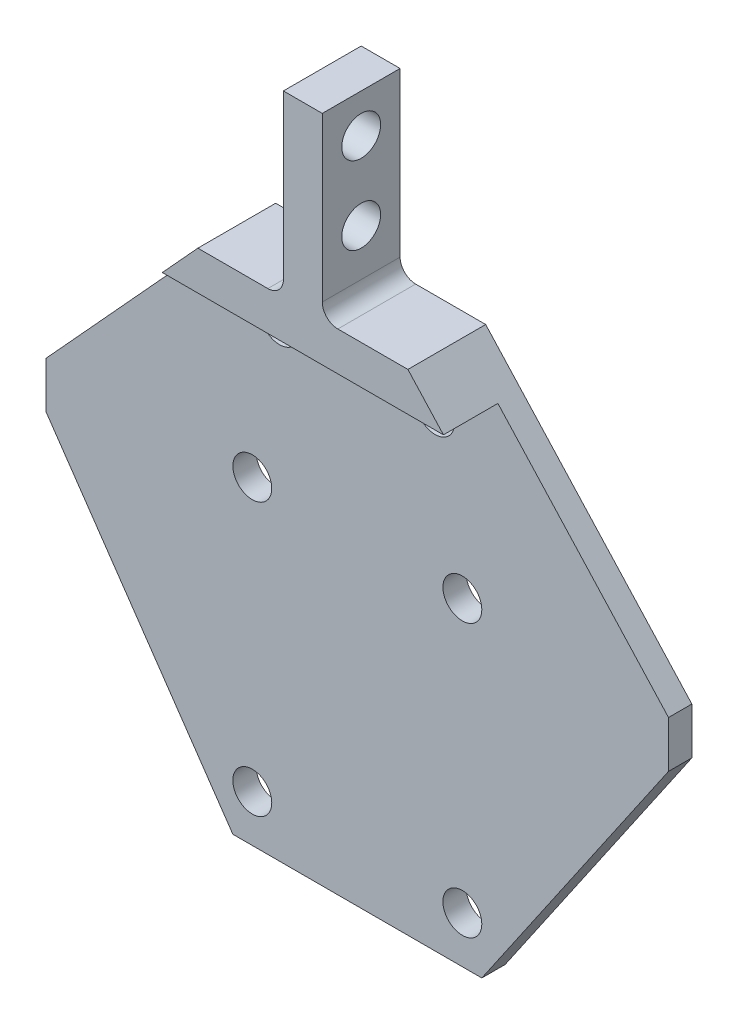
ISO-10303-21;
HEADER;
FILE_DESCRIPTION(('STEP AP214'),'2;1');
FILE_NAME('part.step','',(''),(''),'','','');
FILE_SCHEMA(('AUTOMOTIVE_DESIGN { 1 0 10303 214 1 1 1 1 }'));
ENDSEC;
DATA;
#1=APPLICATION_CONTEXT('core data for automotive mechanical design processes');
#2=APPLICATION_PROTOCOL_DEFINITION('international standard','automotive_design',2000,#1);
#3=PRODUCT_CONTEXT('',#1,'mechanical');
#4=PRODUCT('Part','Part','',(#3));
#5=PRODUCT_RELATED_PRODUCT_CATEGORY('part','',(#4));
#6=PRODUCT_DEFINITION_FORMATION('','',#4);
#7=PRODUCT_DEFINITION_CONTEXT('part definition',#1,'design');
#8=PRODUCT_DEFINITION('design','',#6,#7);
#9=PRODUCT_DEFINITION_SHAPE('','',#8);
#10=(LENGTH_UNIT() NAMED_UNIT(*) SI_UNIT(.MILLI.,.METRE.));
#11=(NAMED_UNIT(*) PLANE_ANGLE_UNIT() SI_UNIT($,.RADIAN.));
#12=(NAMED_UNIT(*) SI_UNIT($,.STERADIAN.) SOLID_ANGLE_UNIT());
#13=UNCERTAINTY_MEASURE_WITH_UNIT(LENGTH_MEASURE(1.E-05),#10,'distance_accuracy_value','');
#14=(GEOMETRIC_REPRESENTATION_CONTEXT(3) GLOBAL_UNCERTAINTY_ASSIGNED_CONTEXT((#13)) GLOBAL_UNIT_ASSIGNED_CONTEXT((#10,
#11,#12)) REPRESENTATION_CONTEXT('',''));
#15=CARTESIAN_POINT('',(0.,0.,0.));
#16=DIRECTION('',(0.,0.,1.));
#17=DIRECTION('',(1.,0.,0.));
#18=AXIS2_PLACEMENT_3D('',#15,#16,#17);
#19=CARTESIAN_POINT('',(0.,29.,3.));
#20=DIRECTION('',(0.,1.,0.));
#21=DIRECTION('',(0.,0.,1.));
#22=AXIS2_PLACEMENT_3D('',#19,#20,#21);
#23=PLANE('',#22);
#24=DIRECTION('',(-1.,0.,0.));
#25=VECTOR('',#24,1.);
#26=CARTESIAN_POINT('',(13.5,29.,10.));
#27=LINE('',#26,#25);
#28=CARTESIAN_POINT('',(-4.50437935032591,29.,10.));
#29=VERTEX_POINT('',#28);
#30=CARTESIAN_POINT('',(-13.5,29.,10.));
#31=VERTEX_POINT('',#30);
#32=EDGE_CURVE('E200',#29,#31,#27,.T.);
#33=ORIENTED_EDGE('',*,*,#32,.F.);
#34=DIRECTION('',(0.,0.,-1.));
#35=VECTOR('',#34,1.);
#36=CARTESIAN_POINT('',(-4.50437935032591,29.,3.));
#37=LINE('',#36,#35);
#38=CARTESIAN_POINT('',(-4.50437935032591,29.,0.));
#39=VERTEX_POINT('',#38);
#40=EDGE_CURVE('E313',#29,#39,#37,.T.);
#41=ORIENTED_EDGE('',*,*,#40,.T.);
#42=DIRECTION('',(1.,0.,0.));
#43=VECTOR('',#42,1.);
#44=CARTESIAN_POINT('',(0.,29.,0.));
#45=LINE('',#44,#43);
#46=CARTESIAN_POINT('',(-13.5,29.,0.));
#47=VERTEX_POINT('',#46);
#48=EDGE_CURVE('E261',#47,#39,#45,.T.);
#49=ORIENTED_EDGE('',*,*,#48,.F.);
#50=DIRECTION('',(0.,0.,-1.));
#51=VECTOR('',#50,1.);
#52=CARTESIAN_POINT('',(-13.5,29.,3.));
#53=LINE('',#52,#51);
#54=EDGE_CURVE('E297',#31,#47,#53,.T.);
#55=ORIENTED_EDGE('',*,*,#54,.F.);
#56=EDGE_LOOP('',(#33,#41,#49,#55));
#57=FACE_BOUND('',#56,.T.);
#58=ADVANCED_FACE('F41',(#57),#23,.T.);
#59=CARTESIAN_POINT('',(21.7981532480156,19.9190021059452,3.));
#60=DIRECTION('',(0.738209882892656,0.674571099884668,0.));
#61=DIRECTION('',(-0.674571099884668,0.738209882892656,0.));
#62=AXIS2_PLACEMENT_3D('',#59,#60,#61);
#63=PLANE('',#62);
#64=DIRECTION('',(0.674571099884668,-0.738209882892656,0.));
#65=VECTOR('',#64,1.);
#66=CARTESIAN_POINT('',(21.7981532480156,19.9190021059452,0.));
#67=LINE('',#66,#65);
#68=CARTESIAN_POINT('',(13.5,29.,0.));
#69=VERTEX_POINT('',#68);
#70=CARTESIAN_POINT('',(40.,0.,0.));
#71=VERTEX_POINT('',#70);
#72=EDGE_CURVE('E258',#69,#71,#67,.T.);
#73=ORIENTED_EDGE('',*,*,#72,.F.);
#74=DIRECTION('',(0.,0.,-1.));
#75=VECTOR('',#74,1.);
#76=CARTESIAN_POINT('',(13.5,29.,3.));
#77=LINE('',#76,#75);
#78=CARTESIAN_POINT('',(13.5,29.,10.));
#79=VERTEX_POINT('',#78);
#80=EDGE_CURVE('E299',#79,#69,#77,.T.);
#81=ORIENTED_EDGE('',*,*,#80,.F.);
#82=DIRECTION('',(-0.674571099884668,0.738209882892656,0.));
#83=VECTOR('',#82,1.);
#84=CARTESIAN_POINT('',(18.0689655172414,24.,10.));
#85=LINE('',#84,#83);
#86=CARTESIAN_POINT('',(18.0689655172414,24.,10.));
#87=VERTEX_POINT('',#86);
#88=EDGE_CURVE('E204',#87,#79,#85,.T.);
#89=ORIENTED_EDGE('',*,*,#88,.F.);
#90=DIRECTION('',(0.,0.,-1.));
#91=VECTOR('',#90,1.);
#92=CARTESIAN_POINT('',(18.0689655172414,24.,10.));
#93=LINE('',#92,#91);
#94=CARTESIAN_POINT('',(18.0689655172414,24.,3.));
#95=VERTEX_POINT('',#94);
#96=EDGE_CURVE('E207',#87,#95,#93,.T.);
#97=ORIENTED_EDGE('',*,*,#96,.T.);
#98=DIRECTION('',(0.674571099884668,-0.738209882892656,0.));
#99=VECTOR('',#98,1.);
#100=CARTESIAN_POINT('',(21.7981532480156,19.9190021059452,3.));
#101=LINE('',#100,#99);
#102=CARTESIAN_POINT('',(40.,0.,3.));
#103=VERTEX_POINT('',#102);
#104=EDGE_CURVE('E226',#95,#103,#101,.T.);
#105=ORIENTED_EDGE('',*,*,#104,.T.);
#106=DIRECTION('',(0.,0.,-1.));
#107=VECTOR('',#106,1.);
#108=CARTESIAN_POINT('',(40.,0.,3.));
#109=LINE('',#108,#107);
#110=EDGE_CURVE('E249',#103,#71,#109,.T.);
#111=ORIENTED_EDGE('',*,*,#110,.T.);
#112=EDGE_LOOP('',(#73,#81,#89,#97,#105,#111));
#113=FACE_BOUND('',#112,.T.);
#114=ADVANCED_FACE('F333',(#113),#63,.T.);
#115=CARTESIAN_POINT('',(4.49562064967409,29.,0.));
#116=VERTEX_POINT('',#115);
#117=EDGE_CURVE('E260',#116,#69,#45,.T.);
#118=ORIENTED_EDGE('',*,*,#117,.F.);
#119=DIRECTION('',(0.,0.,-1.));
#120=VECTOR('',#119,1.);
#121=CARTESIAN_POINT('',(4.49562064967409,29.,9.99999999999999));
#122=LINE('',#121,#120);
#123=CARTESIAN_POINT('',(4.49562064967409,29.,10.));
#124=VERTEX_POINT('',#123);
#125=EDGE_CURVE('E311',#116,#124,#122,.F.);
#126=ORIENTED_EDGE('',*,*,#125,.T.);
#127=EDGE_CURVE('E196',#79,#124,#27,.T.);
#128=ORIENTED_EDGE('',*,*,#127,.F.);
#129=ORIENTED_EDGE('',*,*,#80,.T.);
#130=EDGE_LOOP('',(#118,#126,#128,#129));
#131=FACE_BOUND('',#130,.T.);
#132=ADVANCED_FACE('F329',(#131),#23,.T.);
#133=CARTESIAN_POINT('',(-21.7981532480156,19.9190021059452,3.));
#134=DIRECTION('',(-0.738209882892656,0.674571099884668,0.));
#135=DIRECTION('',(-0.674571099884668,-0.738209882892656,0.));
#136=AXIS2_PLACEMENT_3D('',#133,#134,#135);
#137=PLANE('',#136);
#138=DIRECTION('',(0.674571099884668,0.738209882892656,0.));
#139=VECTOR('',#138,1.);
#140=CARTESIAN_POINT('',(-21.7981532480156,19.9190021059452,0.));
#141=LINE('',#140,#139);
#142=CARTESIAN_POINT('',(-40.,0.,0.));
#143=VERTEX_POINT('',#142);
#144=EDGE_CURVE('E263',#143,#47,#141,.T.);
#145=ORIENTED_EDGE('',*,*,#144,.F.);
#146=DIRECTION('',(0.,0.,-1.));
#147=VECTOR('',#146,1.);
#148=CARTESIAN_POINT('',(-40.,0.,3.));
#149=LINE('',#148,#147);
#150=CARTESIAN_POINT('',(-40.,0.,3.));
#151=VERTEX_POINT('',#150);
#152=EDGE_CURVE('E295',#151,#143,#149,.T.);
#153=ORIENTED_EDGE('',*,*,#152,.F.);
#154=DIRECTION('',(0.674571099884668,0.738209882892656,0.));
#155=VECTOR('',#154,1.);
#156=CARTESIAN_POINT('',(-21.7981532480156,19.9190021059452,3.));
#157=LINE('',#156,#155);
#158=CARTESIAN_POINT('',(-18.0689655172414,24.,3.));
#159=VERTEX_POINT('',#158);
#160=EDGE_CURVE('E228',#151,#159,#157,.T.);
#161=ORIENTED_EDGE('',*,*,#160,.T.);
#162=DIRECTION('',(0.,0.,-1.));
#163=VECTOR('',#162,1.);
#164=CARTESIAN_POINT('',(-18.0689655172414,24.,10.));
#165=LINE('',#164,#163);
#166=CARTESIAN_POINT('',(-18.0689655172414,24.,10.));
#167=VERTEX_POINT('',#166);
#168=EDGE_CURVE('E212',#167,#159,#165,.T.);
#169=ORIENTED_EDGE('',*,*,#168,.F.);
#170=DIRECTION('',(-0.674571099884668,-0.738209882892656,0.));
#171=VECTOR('',#170,1.);
#172=CARTESIAN_POINT('',(-13.5,29.,10.));
#173=LINE('',#172,#171);
#174=EDGE_CURVE('E199',#31,#167,#173,.T.);
#175=ORIENTED_EDGE('',*,*,#174,.F.);
#176=ORIENTED_EDGE('',*,*,#54,.T.);
#177=EDGE_LOOP('',(#145,#153,#161,#169,#175,#176));
#178=FACE_BOUND('',#177,.T.);
#179=ADVANCED_FACE('F354',(#178),#137,.T.);
#180=CARTESIAN_POINT('',(-40.,0.,3.));
#181=DIRECTION('',(-1.,0.,0.));
#182=DIRECTION('',(0.,0.,1.));
#183=AXIS2_PLACEMENT_3D('',#180,#181,#182);
#184=PLANE('',#183);
#185=DIRECTION('',(0.,1.,0.));
#186=VECTOR('',#185,1.);
#187=CARTESIAN_POINT('',(-40.,0.,0.));
#188=LINE('',#187,#186);
#189=CARTESIAN_POINT('',(-40.,-6.,0.));
#190=VERTEX_POINT('',#189);
#191=EDGE_CURVE('E266',#190,#143,#188,.T.);
#192=ORIENTED_EDGE('',*,*,#191,.F.);
#193=DIRECTION('',(0.,0.,-1.));
#194=VECTOR('',#193,1.);
#195=CARTESIAN_POINT('',(-40.,-6.,3.));
#196=LINE('',#195,#194);
#197=CARTESIAN_POINT('',(-40.,-6.,3.));
#198=VERTEX_POINT('',#197);
#199=EDGE_CURVE('E293',#198,#190,#196,.T.);
#200=ORIENTED_EDGE('',*,*,#199,.F.);
#201=DIRECTION('',(0.,1.,0.));
#202=VECTOR('',#201,1.);
#203=CARTESIAN_POINT('',(-40.,0.,3.));
#204=LINE('',#203,#202);
#205=EDGE_CURVE('E231',#198,#151,#204,.T.);
#206=ORIENTED_EDGE('',*,*,#205,.T.);
#207=ORIENTED_EDGE('',*,*,#152,.T.);
#208=EDGE_LOOP('',(#192,#200,#206,#207));
#209=FACE_BOUND('',#208,.T.);
#210=ADVANCED_FACE('F348',(#209),#184,.T.);
#211=CARTESIAN_POINT('',(-30.0055524708495,-20.5752359800111,3.));
#212=DIRECTION('',(0.824728851845978,0.565528355551528,0.));
#213=DIRECTION('',(-0.565528355551528,0.824728851845978,0.));
#214=AXIS2_PLACEMENT_3D('',#211,#212,#213);
#215=PLANE('',#214);
#216=DIRECTION('',(0.565528355551528,-0.824728851845978,0.));
#217=VECTOR('',#216,1.);
#218=CARTESIAN_POINT('',(-30.0055524708495,-20.5752359800111,0.));
#219=LINE('',#218,#217);
#220=CARTESIAN_POINT('',(-16.,-41.,0.));
#221=VERTEX_POINT('',#220);
#222=EDGE_CURVE('E269',#190,#221,#219,.T.);
#223=ORIENTED_EDGE('',*,*,#222,.T.);
#224=DIRECTION('',(0.,0.,-1.));
#225=VECTOR('',#224,1.);
#226=CARTESIAN_POINT('',(-16.,-41.,3.));
#227=LINE('',#226,#225);
#228=CARTESIAN_POINT('',(-16.,-41.,3.));
#229=VERTEX_POINT('',#228);
#230=EDGE_CURVE('E290',#229,#221,#227,.T.);
#231=ORIENTED_EDGE('',*,*,#230,.F.);
#232=DIRECTION('',(0.565528355551528,-0.824728851845978,0.));
#233=VECTOR('',#232,1.);
#234=CARTESIAN_POINT('',(-30.0055524708495,-20.5752359800111,3.));
#235=LINE('',#234,#233);
#236=EDGE_CURVE('E234',#198,#229,#235,.T.);
#237=ORIENTED_EDGE('',*,*,#236,.F.);
#238=ORIENTED_EDGE('',*,*,#199,.T.);
#239=EDGE_LOOP('',(#223,#231,#237,#238));
#240=FACE_BOUND('',#239,.T.);
#241=ADVANCED_FACE('F396',(#240),#215,.F.);
#242=CARTESIAN_POINT('',(0.,-41.,3.));
#243=DIRECTION('',(0.,1.,0.));
#244=DIRECTION('',(0.,0.,1.));
#245=AXIS2_PLACEMENT_3D('',#242,#243,#244);
#246=PLANE('',#245);
#247=DIRECTION('',(1.,0.,0.));
#248=VECTOR('',#247,1.);
#249=CARTESIAN_POINT('',(0.,-41.,0.));
#250=LINE('',#249,#248);
#251=CARTESIAN_POINT('',(16.,-41.,0.));
#252=VERTEX_POINT('',#251);
#253=EDGE_CURVE('E272',#221,#252,#250,.T.);
#254=ORIENTED_EDGE('',*,*,#253,.T.);
#255=DIRECTION('',(0.,0.,-1.));
#256=VECTOR('',#255,1.);
#257=CARTESIAN_POINT('',(16.,-41.,3.));
#258=LINE('',#257,#256);
#259=CARTESIAN_POINT('',(16.,-41.,3.));
#260=VERTEX_POINT('',#259);
#261=EDGE_CURVE('E287',#260,#252,#258,.T.);
#262=ORIENTED_EDGE('',*,*,#261,.F.);
#263=DIRECTION('',(1.,0.,0.));
#264=VECTOR('',#263,1.);
#265=CARTESIAN_POINT('',(0.,-41.,3.));
#266=LINE('',#265,#264);
#267=EDGE_CURVE('E237',#229,#260,#266,.T.);
#268=ORIENTED_EDGE('',*,*,#267,.F.);
#269=ORIENTED_EDGE('',*,*,#230,.T.);
#270=EDGE_LOOP('',(#254,#262,#268,#269));
#271=FACE_BOUND('',#270,.T.);
#272=ADVANCED_FACE('F342',(#271),#246,.F.);
#273=CARTESIAN_POINT('',(30.0055524708495,-20.5752359800111,3.));
#274=DIRECTION('',(-0.824728851845978,0.565528355551527,0.));
#275=DIRECTION('',(-0.565528355551528,-0.824728851845978,0.));
#276=AXIS2_PLACEMENT_3D('',#273,#274,#275);
#277=PLANE('',#276);
#278=DIRECTION('',(0.565528355551528,0.824728851845978,0.));
#279=VECTOR('',#278,1.);
#280=CARTESIAN_POINT('',(30.0055524708495,-20.5752359800111,0.));
#281=LINE('',#280,#279);
#282=CARTESIAN_POINT('',(40.,-6.,0.));
#283=VERTEX_POINT('',#282);
#284=EDGE_CURVE('E275',#252,#283,#281,.T.);
#285=ORIENTED_EDGE('',*,*,#284,.T.);
#286=DIRECTION('',(0.,0.,-1.));
#287=VECTOR('',#286,1.);
#288=CARTESIAN_POINT('',(40.,-6.,3.));
#289=LINE('',#288,#287);
#290=CARTESIAN_POINT('',(40.,-6.,3.));
#291=VERTEX_POINT('',#290);
#292=EDGE_CURVE('E284',#291,#283,#289,.T.);
#293=ORIENTED_EDGE('',*,*,#292,.F.);
#294=DIRECTION('',(0.565528355551528,0.824728851845978,0.));
#295=VECTOR('',#294,1.);
#296=CARTESIAN_POINT('',(30.0055524708495,-20.5752359800111,3.));
#297=LINE('',#296,#295);
#298=EDGE_CURVE('E240',#260,#291,#297,.T.);
#299=ORIENTED_EDGE('',*,*,#298,.F.);
#300=ORIENTED_EDGE('',*,*,#261,.T.);
#301=EDGE_LOOP('',(#285,#293,#299,#300));
#302=FACE_BOUND('',#301,.T.);
#303=ADVANCED_FACE('F339',(#302),#277,.F.);
#304=CARTESIAN_POINT('',(40.,0.,3.));
#305=DIRECTION('',(-1.,0.,0.));
#306=DIRECTION('',(0.,0.,1.));
#307=AXIS2_PLACEMENT_3D('',#304,#305,#306);
#308=PLANE('',#307);
#309=DIRECTION('',(0.,1.,0.));
#310=VECTOR('',#309,1.);
#311=CARTESIAN_POINT('',(40.,0.,0.));
#312=LINE('',#311,#310);
#313=EDGE_CURVE('E278',#283,#71,#312,.T.);
#314=ORIENTED_EDGE('',*,*,#313,.T.);
#315=ORIENTED_EDGE('',*,*,#110,.F.);
#316=DIRECTION('',(0.,1.,0.));
#317=VECTOR('',#316,1.);
#318=CARTESIAN_POINT('',(40.,0.,3.));
#319=LINE('',#318,#317);
#320=EDGE_CURVE('E243',#291,#103,#319,.T.);
#321=ORIENTED_EDGE('',*,*,#320,.F.);
#322=ORIENTED_EDGE('',*,*,#292,.T.);
#323=EDGE_LOOP('',(#314,#315,#321,#322));
#324=FACE_BOUND('',#323,.T.);
#325=ADVANCED_FACE('F337',(#324),#308,.F.);
#326=CARTESIAN_POINT('',(-13.5,0.,3.));
#327=DIRECTION('',(0.,0.,-1.));
#328=DIRECTION('',(-1.,0.,0.));
#329=AXIS2_PLACEMENT_3D('',#326,#327,#328);
#330=CYLINDRICAL_SURFACE('',#329,2.5);
#331=CARTESIAN_POINT('',(-13.5,0.,3.));
#332=DIRECTION('',(0.,0.,1.));
#333=DIRECTION('',(1.,0.,0.));
#334=AXIS2_PLACEMENT_3D('',#331,#332,#333);
#335=CIRCLE('',#334,2.5);
#336=CARTESIAN_POINT('',(-11.,0.,3.));
#337=VERTEX_POINT('',#336);
#338=EDGE_CURVE('E223',#337,#337,#335,.T.);
#339=ORIENTED_EDGE('',*,*,#338,.T.);
#340=EDGE_LOOP('',(#339));
#341=FACE_BOUND('',#340,.T.);
#342=CARTESIAN_POINT('',(-13.5,0.,0.));
#343=DIRECTION('',(0.,0.,1.));
#344=DIRECTION('',(1.,0.,0.));
#345=AXIS2_PLACEMENT_3D('',#342,#343,#344);
#346=CIRCLE('',#345,2.5);
#347=CARTESIAN_POINT('',(-11.,0.,0.));
#348=VERTEX_POINT('',#347);
#349=EDGE_CURVE('E255',#348,#348,#346,.T.);
#350=ORIENTED_EDGE('',*,*,#349,.F.);
#351=EDGE_LOOP('',(#350));
#352=FACE_BOUND('',#351,.T.);
#353=ADVANCED_FACE('F407',(#341,#352),#330,.F.);
#354=CARTESIAN_POINT('',(13.5,-35.,3.));
#355=DIRECTION('',(0.,0.,-1.));
#356=DIRECTION('',(-1.,0.,0.));
#357=AXIS2_PLACEMENT_3D('',#354,#355,#356);
#358=CYLINDRICAL_SURFACE('',#357,2.5);
#359=CARTESIAN_POINT('',(13.5,-35.,3.));
#360=DIRECTION('',(0.,0.,1.));
#361=DIRECTION('',(1.,0.,0.));
#362=AXIS2_PLACEMENT_3D('',#359,#360,#361);
#363=CIRCLE('',#362,2.5);
#364=CARTESIAN_POINT('',(16.,-35.,3.));
#365=VERTEX_POINT('',#364);
#366=EDGE_CURVE('E219',#365,#365,#363,.F.);
#367=ORIENTED_EDGE('',*,*,#366,.F.);
#368=EDGE_LOOP('',(#367));
#369=FACE_BOUND('',#368,.T.);
#370=CARTESIAN_POINT('',(13.5,-35.,0.));
#371=DIRECTION('',(0.,0.,1.));
#372=DIRECTION('',(1.,0.,0.));
#373=AXIS2_PLACEMENT_3D('',#370,#371,#372);
#374=CIRCLE('',#373,2.5);
#375=CARTESIAN_POINT('',(16.,-35.,0.));
#376=VERTEX_POINT('',#375);
#377=EDGE_CURVE('E252',#376,#376,#374,.F.);
#378=ORIENTED_EDGE('',*,*,#377,.T.);
#379=EDGE_LOOP('',(#378));
#380=FACE_BOUND('',#379,.T.);
#381=ADVANCED_FACE('F477',(#369,#380),#358,.F.);
#382=CARTESIAN_POINT('',(13.5,0.,3.));
#383=DIRECTION('',(0.,0.,-1.));
#384=DIRECTION('',(-1.,0.,0.));
#385=AXIS2_PLACEMENT_3D('',#382,#383,#384);
#386=CYLINDRICAL_SURFACE('',#385,2.5);
#387=CARTESIAN_POINT('',(13.5,0.,3.));
#388=DIRECTION('',(0.,0.,1.));
#389=DIRECTION('',(1.,0.,0.));
#390=AXIS2_PLACEMENT_3D('',#387,#388,#389);
#391=CIRCLE('',#390,2.5);
#392=CARTESIAN_POINT('',(16.,0.,3.));
#393=VERTEX_POINT('',#392);
#394=EDGE_CURVE('E216',#393,#393,#391,.T.);
#395=ORIENTED_EDGE('',*,*,#394,.T.);
#396=EDGE_LOOP('',(#395));
#397=FACE_BOUND('',#396,.T.);
#398=CARTESIAN_POINT('',(13.5,0.,0.));
#399=DIRECTION('',(0.,0.,1.));
#400=DIRECTION('',(1.,0.,0.));
#401=AXIS2_PLACEMENT_3D('',#398,#399,#400);
#402=CIRCLE('',#401,2.5);
#403=CARTESIAN_POINT('',(16.,0.,0.));
#404=VERTEX_POINT('',#403);
#405=EDGE_CURVE('E215',#404,#404,#402,.T.);
#406=ORIENTED_EDGE('',*,*,#405,.F.);
#407=EDGE_LOOP('',(#406));
#408=FACE_BOUND('',#407,.T.);
#409=ADVANCED_FACE('F412',(#397,#408),#386,.F.);
#410=CARTESIAN_POINT('',(-13.5,-35.,3.));
#411=DIRECTION('',(0.,0.,-1.));
#412=DIRECTION('',(-1.,0.,0.));
#413=AXIS2_PLACEMENT_3D('',#410,#411,#412);
#414=CYLINDRICAL_SURFACE('',#413,2.5);
#415=CARTESIAN_POINT('',(-13.5,-35.,3.));
#416=DIRECTION('',(0.,0.,1.));
#417=DIRECTION('',(1.,0.,0.));
#418=AXIS2_PLACEMENT_3D('',#415,#416,#417);
#419=CIRCLE('',#418,2.5);
#420=CARTESIAN_POINT('',(-11.,-35.,3.));
#421=VERTEX_POINT('',#420);
#422=EDGE_CURVE('E246',#421,#421,#419,.F.);
#423=ORIENTED_EDGE('',*,*,#422,.F.);
#424=EDGE_LOOP('',(#423));
#425=FACE_BOUND('',#424,.T.);
#426=CARTESIAN_POINT('',(-13.5,-35.,0.));
#427=DIRECTION('',(0.,0.,1.));
#428=DIRECTION('',(1.,0.,0.));
#429=AXIS2_PLACEMENT_3D('',#426,#427,#428);
#430=CIRCLE('',#429,2.5);
#431=CARTESIAN_POINT('',(-11.,-35.,0.));
#432=VERTEX_POINT('',#431);
#433=EDGE_CURVE('E220',#432,#432,#430,.F.);
#434=ORIENTED_EDGE('',*,*,#433,.T.);
#435=EDGE_LOOP('',(#434));
#436=FACE_BOUND('',#435,.T.);
#437=ADVANCED_FACE('F408',(#425,#436),#414,.F.);
#438=CARTESIAN_POINT('',(0.,0.,3.));
#439=DIRECTION('',(0.,0.,1.));
#440=DIRECTION('',(1.,0.,0.));
#441=AXIS2_PLACEMENT_3D('',#438,#439,#440);
#442=PLANE('',#441);
#443=CARTESIAN_POINT('',(-10.,19.,3.));
#444=DIRECTION('',(0.,0.,1.));
#445=DIRECTION('',(1.,0.,0.));
#446=AXIS2_PLACEMENT_3D('',#443,#444,#445);
#447=CIRCLE('',#446,2.5);
#448=CARTESIAN_POINT('',(-7.5,19.,3.));
#449=VERTEX_POINT('',#448);
#450=EDGE_CURVE('E306',#449,#449,#447,.T.);
#451=ORIENTED_EDGE('',*,*,#450,.F.);
#452=EDGE_LOOP('',(#451));
#453=FACE_BOUND('',#452,.T.);
#454=CARTESIAN_POINT('',(9.99999999999999,19.,3.));
#455=DIRECTION('',(0.,0.,1.));
#456=DIRECTION('',(-1.,0.,0.));
#457=AXIS2_PLACEMENT_3D('',#454,#455,#456);
#458=CIRCLE('',#457,2.5);
#459=CARTESIAN_POINT('',(7.5,19.,3.));
#460=VERTEX_POINT('',#459);
#461=EDGE_CURVE('E544',#460,#460,#458,.T.);
#462=ORIENTED_EDGE('',*,*,#461,.F.);
#463=EDGE_LOOP('',(#462));
#464=FACE_BOUND('',#463,.T.);
#465=DIRECTION('',(1.,0.,0.));
#466=VECTOR('',#465,1.);
#467=CARTESIAN_POINT('',(-18.0689655172414,24.,3.));
#468=LINE('',#467,#466);
#469=EDGE_CURVE('E194',#159,#95,#468,.T.);
#470=ORIENTED_EDGE('',*,*,#469,.F.);
#471=ORIENTED_EDGE('',*,*,#160,.F.);
#472=ORIENTED_EDGE('',*,*,#205,.F.);
#473=ORIENTED_EDGE('',*,*,#236,.T.);
#474=ORIENTED_EDGE('',*,*,#267,.T.);
#475=ORIENTED_EDGE('',*,*,#298,.T.);
#476=ORIENTED_EDGE('',*,*,#320,.T.);
#477=ORIENTED_EDGE('',*,*,#104,.F.);
#478=EDGE_LOOP('',(#470,#471,#472,#473,#474,#475,#476,#477));
#479=FACE_BOUND('',#478,.T.);
#480=ORIENTED_EDGE('',*,*,#394,.F.);
#481=EDGE_LOOP('',(#480));
#482=FACE_BOUND('',#481,.T.);
#483=ORIENTED_EDGE('',*,*,#366,.T.);
#484=EDGE_LOOP('',(#483));
#485=FACE_BOUND('',#484,.T.);
#486=ORIENTED_EDGE('',*,*,#338,.F.);
#487=EDGE_LOOP('',(#486));
#488=FACE_BOUND('',#487,.T.);
#489=ORIENTED_EDGE('',*,*,#422,.T.);
#490=EDGE_LOOP('',(#489));
#491=FACE_BOUND('',#490,.T.);
#492=ADVANCED_FACE('F411',(#453,#464,#479,#482,#485,#488,#491),#442,.T.);
#493=CARTESIAN_POINT('',(0.,0.,0.));
#494=DIRECTION('',(0.,0.,1.));
#495=DIRECTION('',(1.,0.,0.));
#496=AXIS2_PLACEMENT_3D('',#493,#494,#495);
#497=PLANE('',#496);
#498=CARTESIAN_POINT('',(-10.,19.,0.));
#499=DIRECTION('',(0.,0.,1.));
#500=DIRECTION('',(1.,0.,0.));
#501=AXIS2_PLACEMENT_3D('',#498,#499,#500);
#502=CIRCLE('',#501,2.5);
#503=CARTESIAN_POINT('',(-7.5,19.,0.));
#504=VERTEX_POINT('',#503);
#505=EDGE_CURVE('E305',#504,#504,#502,.T.);
#506=ORIENTED_EDGE('',*,*,#505,.T.);
#507=EDGE_LOOP('',(#506));
#508=FACE_BOUND('',#507,.T.);
#509=CARTESIAN_POINT('',(9.99999999999999,19.,0.));
#510=DIRECTION('',(0.,0.,1.));
#511=DIRECTION('',(1.,0.,0.));
#512=AXIS2_PLACEMENT_3D('',#509,#510,#511);
#513=CIRCLE('',#512,2.5);
#514=CARTESIAN_POINT('',(12.5,19.,0.));
#515=VERTEX_POINT('',#514);
#516=EDGE_CURVE('E302',#515,#515,#513,.T.);
#517=ORIENTED_EDGE('',*,*,#516,.T.);
#518=EDGE_LOOP('',(#517));
#519=FACE_BOUND('',#518,.T.);
#520=ORIENTED_EDGE('',*,*,#405,.T.);
#521=EDGE_LOOP('',(#520));
#522=FACE_BOUND('',#521,.T.);
#523=ORIENTED_EDGE('',*,*,#377,.F.);
#524=EDGE_LOOP('',(#523));
#525=FACE_BOUND('',#524,.T.);
#526=ORIENTED_EDGE('',*,*,#349,.T.);
#527=EDGE_LOOP('',(#526));
#528=FACE_BOUND('',#527,.T.);
#529=ORIENTED_EDGE('',*,*,#72,.T.);
#530=ORIENTED_EDGE('',*,*,#313,.F.);
#531=ORIENTED_EDGE('',*,*,#284,.F.);
#532=ORIENTED_EDGE('',*,*,#253,.F.);
#533=ORIENTED_EDGE('',*,*,#222,.F.);
#534=ORIENTED_EDGE('',*,*,#191,.T.);
#535=ORIENTED_EDGE('',*,*,#144,.T.);
#536=ORIENTED_EDGE('',*,*,#48,.T.);
#537=CARTESIAN_POINT('',(-4.50437935032591,31.,0.));
#538=DIRECTION('',(0.,0.,1.));
#539=DIRECTION('',(1.,0.,0.));
#540=AXIS2_PLACEMENT_3D('',#537,#538,#539);
#541=CIRCLE('',#540,2.);
#542=CARTESIAN_POINT('',(-2.50437935032591,31.,0.));
#543=VERTEX_POINT('',#542);
#544=EDGE_CURVE('E49',#39,#543,#541,.T.);
#545=ORIENTED_EDGE('',*,*,#544,.T.);
#546=DIRECTION('',(0.,1.,0.));
#547=VECTOR('',#546,1.);
#548=CARTESIAN_POINT('',(-2.50437935032591,29.,0.));
#549=LINE('',#548,#547);
#550=CARTESIAN_POINT('',(-2.50437935032591,52.,0.));
#551=VERTEX_POINT('',#550);
#552=EDGE_CURVE('E171',#543,#551,#549,.T.);
#553=ORIENTED_EDGE('',*,*,#552,.T.);
#554=DIRECTION('',(1.,0.,0.));
#555=VECTOR('',#554,1.);
#556=CARTESIAN_POINT('',(-2.50437935032591,52.,0.));
#557=LINE('',#556,#555);
#558=CARTESIAN_POINT('',(2.49562064967409,52.,0.));
#559=VERTEX_POINT('',#558);
#560=EDGE_CURVE('E167',#551,#559,#557,.T.);
#561=ORIENTED_EDGE('',*,*,#560,.T.);
#562=DIRECTION('',(0.,1.,0.));
#563=VECTOR('',#562,1.);
#564=CARTESIAN_POINT('',(2.49562064967409,29.,0.));
#565=LINE('',#564,#563);
#566=CARTESIAN_POINT('',(2.49562064967409,31.,0.));
#567=VERTEX_POINT('',#566);
#568=EDGE_CURVE('E154',#567,#559,#565,.T.);
#569=ORIENTED_EDGE('',*,*,#568,.F.);
#570=CARTESIAN_POINT('',(4.49562064967409,31.,0.));
#571=DIRECTION('',(0.,0.,1.));
#572=DIRECTION('',(1.,0.,0.));
#573=AXIS2_PLACEMENT_3D('',#570,#571,#572);
#574=CIRCLE('',#573,2.);
#575=EDGE_CURVE('E317',#567,#116,#574,.T.);
#576=ORIENTED_EDGE('',*,*,#575,.T.);
#577=ORIENTED_EDGE('',*,*,#117,.T.);
#578=EDGE_LOOP('',(#529,#530,#531,#532,#533,#534,#535,#536,#545,#553,#561,#569,#576,#577));
#579=FACE_BOUND('',#578,.T.);
#580=ORIENTED_EDGE('',*,*,#433,.F.);
#581=EDGE_LOOP('',(#580));
#582=FACE_BOUND('',#581,.T.);
#583=ADVANCED_FACE('F169',(#508,#519,#522,#525,#528,#579,#582),#497,.F.);
#584=CARTESIAN_POINT('',(-18.0689655172414,24.,10.));
#585=DIRECTION('',(0.,1.,0.));
#586=DIRECTION('',(0.,0.,1.));
#587=AXIS2_PLACEMENT_3D('',#584,#585,#586);
#588=PLANE('',#587);
#589=ORIENTED_EDGE('',*,*,#469,.T.);
#590=ORIENTED_EDGE('',*,*,#96,.F.);
#591=DIRECTION('',(1.,0.,0.));
#592=VECTOR('',#591,1.);
#593=CARTESIAN_POINT('',(-18.0689655172414,24.,10.));
#594=LINE('',#593,#592);
#595=EDGE_CURVE('E202',#167,#87,#594,.T.);
#596=ORIENTED_EDGE('',*,*,#595,.F.);
#597=ORIENTED_EDGE('',*,*,#168,.T.);
#598=EDGE_LOOP('',(#589,#590,#596,#597));
#599=FACE_BOUND('',#598,.T.);
#600=ADVANCED_FACE('F415',(#599),#588,.F.);
#601=CARTESIAN_POINT('',(0.,0.,10.));
#602=DIRECTION('',(0.,0.,1.));
#603=DIRECTION('',(1.,0.,0.));
#604=AXIS2_PLACEMENT_3D('',#601,#602,#603);
#605=PLANE('',#604);
#606=ORIENTED_EDGE('',*,*,#127,.T.);
#607=CARTESIAN_POINT('',(4.49562064967409,31.,10.));
#608=DIRECTION('',(0.,0.,1.));
#609=DIRECTION('',(1.,0.,0.));
#610=AXIS2_PLACEMENT_3D('',#607,#608,#609);
#611=CIRCLE('',#610,2.);
#612=CARTESIAN_POINT('',(2.49562064967409,31.,9.99999999999999));
#613=VERTEX_POINT('',#612);
#614=EDGE_CURVE('E319',#124,#613,#611,.F.);
#615=ORIENTED_EDGE('',*,*,#614,.T.);
#616=DIRECTION('',(0.,-1.,0.));
#617=VECTOR('',#616,1.);
#618=CARTESIAN_POINT('',(2.49562064967409,29.,9.99999999999999));
#619=LINE('',#618,#617);
#620=CARTESIAN_POINT('',(2.49562064967409,52.,9.99999999999999));
#621=VERTEX_POINT('',#620);
#622=EDGE_CURVE('E179',#621,#613,#619,.T.);
#623=ORIENTED_EDGE('',*,*,#622,.F.);
#624=DIRECTION('',(1.,0.,0.));
#625=VECTOR('',#624,1.);
#626=CARTESIAN_POINT('',(-2.50437935032591,52.,9.99999999999999));
#627=LINE('',#626,#625);
#628=CARTESIAN_POINT('',(-2.50437935032591,52.,9.99999999999999));
#629=VERTEX_POINT('',#628);
#630=EDGE_CURVE('E175',#629,#621,#627,.T.);
#631=ORIENTED_EDGE('',*,*,#630,.F.);
#632=DIRECTION('',(0.,-1.,0.));
#633=VECTOR('',#632,1.);
#634=CARTESIAN_POINT('',(-2.50437935032591,29.,9.99999999999999));
#635=LINE('',#634,#633);
#636=CARTESIAN_POINT('',(-2.50437935032591,31.,9.99999999999999));
#637=VERTEX_POINT('',#636);
#638=EDGE_CURVE('E176',#629,#637,#635,.T.);
#639=ORIENTED_EDGE('',*,*,#638,.T.);
#640=CARTESIAN_POINT('',(-4.50437935032591,31.,10.));
#641=DIRECTION('',(0.,0.,1.));
#642=DIRECTION('',(1.,0.,0.));
#643=AXIS2_PLACEMENT_3D('',#640,#641,#642);
#644=CIRCLE('',#643,2.);
#645=EDGE_CURVE('E11',#637,#29,#644,.F.);
#646=ORIENTED_EDGE('',*,*,#645,.T.);
#647=ORIENTED_EDGE('',*,*,#32,.T.);
#648=ORIENTED_EDGE('',*,*,#174,.T.);
#649=ORIENTED_EDGE('',*,*,#595,.T.);
#650=ORIENTED_EDGE('',*,*,#88,.T.);
#651=EDGE_LOOP('',(#606,#615,#623,#631,#639,#646,#647,#648,#649,#650));
#652=FACE_BOUND('',#651,.T.);
#653=ADVANCED_FACE('F322',(#652),#605,.T.);
#654=CARTESIAN_POINT('',(-2.50437935032591,52.,0.));
#655=DIRECTION('',(0.,1.,0.));
#656=DIRECTION('',(0.,0.,1.));
#657=AXIS2_PLACEMENT_3D('',#654,#655,#656);
#658=PLANE('',#657);
#659=ORIENTED_EDGE('',*,*,#630,.T.);
#660=DIRECTION('',(0.,0.,1.));
#661=VECTOR('',#660,1.);
#662=CARTESIAN_POINT('',(2.49562064967409,52.,0.));
#663=LINE('',#662,#661);
#664=EDGE_CURVE('E160',#559,#621,#663,.T.);
#665=ORIENTED_EDGE('',*,*,#664,.F.);
#666=ORIENTED_EDGE('',*,*,#560,.F.);
#667=DIRECTION('',(0.,0.,1.));
#668=VECTOR('',#667,1.);
#669=CARTESIAN_POINT('',(-2.50437935032591,52.,0.));
#670=LINE('',#669,#668);
#671=EDGE_CURVE('E191',#551,#629,#670,.T.);
#672=ORIENTED_EDGE('',*,*,#671,.T.);
#673=EDGE_LOOP('',(#659,#665,#666,#672));
#674=FACE_BOUND('',#673,.T.);
#675=ADVANCED_FACE('F178',(#674),#658,.T.);
#676=CARTESIAN_POINT('',(-2.50437935032591,0.,0.));
#677=DIRECTION('',(1.,0.,0.));
#678=DIRECTION('',(0.,0.,-1.));
#679=AXIS2_PLACEMENT_3D('',#676,#677,#678);
#680=PLANE('',#679);
#681=CARTESIAN_POINT('',(-2.50437935032591,37.,5.));
#682=DIRECTION('',(1.,0.,0.));
#683=DIRECTION('',(0.,0.,-1.));
#684=AXIS2_PLACEMENT_3D('',#681,#682,#683);
#685=CIRCLE('',#684,2.5);
#686=CARTESIAN_POINT('',(-2.50437935032591,37.,2.49999999999999));
#687=VERTEX_POINT('',#686);
#688=EDGE_CURVE('E181',#687,#687,#685,.T.);
#689=ORIENTED_EDGE('',*,*,#688,.T.);
#690=EDGE_LOOP('',(#689));
#691=FACE_BOUND('',#690,.T.);
#692=CARTESIAN_POINT('',(-2.50437935032591,47.,5.));
#693=DIRECTION('',(1.,0.,0.));
#694=DIRECTION('',(0.,0.,-1.));
#695=AXIS2_PLACEMENT_3D('',#692,#693,#694);
#696=CIRCLE('',#695,2.5);
#697=CARTESIAN_POINT('',(-2.50437935032591,47.,2.49999999999999));
#698=VERTEX_POINT('',#697);
#699=EDGE_CURVE('E187',#698,#698,#696,.T.);
#700=ORIENTED_EDGE('',*,*,#699,.T.);
#701=EDGE_LOOP('',(#700));
#702=FACE_BOUND('',#701,.T.);
#703=ORIENTED_EDGE('',*,*,#552,.F.);
#704=DIRECTION('',(0.,0.,-1.));
#705=VECTOR('',#704,1.);
#706=CARTESIAN_POINT('',(-2.50437935032591,31.,0.));
#707=LINE('',#706,#705);
#708=EDGE_CURVE('E56',#543,#637,#707,.F.);
#709=ORIENTED_EDGE('',*,*,#708,.T.);
#710=ORIENTED_EDGE('',*,*,#638,.F.);
#711=ORIENTED_EDGE('',*,*,#671,.F.);
#712=EDGE_LOOP('',(#703,#709,#710,#711));
#713=FACE_BOUND('',#712,.T.);
#714=ADVANCED_FACE('F363',(#691,#702,#713),#680,.F.);
#715=CARTESIAN_POINT('',(-2.50437935032591,47.,5.));
#716=DIRECTION('',(1.,0.,0.));
#717=DIRECTION('',(0.,0.,-1.));
#718=AXIS2_PLACEMENT_3D('',#715,#716,#717);
#719=CYLINDRICAL_SURFACE('',#718,2.5);
#720=ORIENTED_EDGE('',*,*,#699,.F.);
#721=EDGE_LOOP('',(#720));
#722=FACE_BOUND('',#721,.T.);
#723=CARTESIAN_POINT('',(2.49562064967409,47.,5.));
#724=DIRECTION('',(1.,0.,0.));
#725=DIRECTION('',(0.,0.,-1.));
#726=AXIS2_PLACEMENT_3D('',#723,#724,#725);
#727=CIRCLE('',#726,2.5);
#728=CARTESIAN_POINT('',(2.49562064967409,47.,2.49999999999999));
#729=VERTEX_POINT('',#728);
#730=EDGE_CURVE('E164',#729,#729,#727,.T.);
#731=ORIENTED_EDGE('',*,*,#730,.T.);
#732=EDGE_LOOP('',(#731));
#733=FACE_BOUND('',#732,.T.);
#734=ADVANCED_FACE('F365',(#722,#733),#719,.F.);
#735=CARTESIAN_POINT('',(-2.50437935032591,37.,5.));
#736=DIRECTION('',(1.,0.,0.));
#737=DIRECTION('',(0.,0.,-1.));
#738=AXIS2_PLACEMENT_3D('',#735,#736,#737);
#739=CYLINDRICAL_SURFACE('',#738,2.5);
#740=ORIENTED_EDGE('',*,*,#688,.F.);
#741=EDGE_LOOP('',(#740));
#742=FACE_BOUND('',#741,.T.);
#743=CARTESIAN_POINT('',(2.49562064967409,37.,5.));
#744=DIRECTION('',(1.,0.,0.));
#745=DIRECTION('',(0.,0.,-1.));
#746=AXIS2_PLACEMENT_3D('',#743,#744,#745);
#747=CIRCLE('',#746,2.5);
#748=CARTESIAN_POINT('',(2.49562064967409,37.,2.49999999999999));
#749=VERTEX_POINT('',#748);
#750=EDGE_CURVE('E309',#749,#749,#747,.T.);
#751=ORIENTED_EDGE('',*,*,#750,.T.);
#752=EDGE_LOOP('',(#751));
#753=FACE_BOUND('',#752,.T.);
#754=ADVANCED_FACE('F373',(#742,#753),#739,.F.);
#755=CARTESIAN_POINT('',(2.49562064967409,0.,0.));
#756=DIRECTION('',(1.,0.,0.));
#757=DIRECTION('',(0.,0.,-1.));
#758=AXIS2_PLACEMENT_3D('',#755,#756,#757);
#759=PLANE('',#758);
#760=ORIENTED_EDGE('',*,*,#730,.F.);
#761=EDGE_LOOP('',(#760));
#762=FACE_BOUND('',#761,.T.);
#763=ORIENTED_EDGE('',*,*,#622,.T.);
#764=DIRECTION('',(0.,0.,-1.));
#765=VECTOR('',#764,1.);
#766=CARTESIAN_POINT('',(2.49562064967409,31.,0.));
#767=LINE('',#766,#765);
#768=EDGE_CURVE('E163',#613,#567,#767,.T.);
#769=ORIENTED_EDGE('',*,*,#768,.T.);
#770=ORIENTED_EDGE('',*,*,#568,.T.);
#771=ORIENTED_EDGE('',*,*,#664,.T.);
#772=EDGE_LOOP('',(#763,#769,#770,#771));
#773=FACE_BOUND('',#772,.T.);
#774=ORIENTED_EDGE('',*,*,#750,.F.);
#775=EDGE_LOOP('',(#774));
#776=FACE_BOUND('',#775,.T.);
#777=ADVANCED_FACE('F157',(#762,#773,#776),#759,.T.);
#778=CARTESIAN_POINT('',(9.99999999999999,19.,-7.));
#779=DIRECTION('',(0.,0.,1.));
#780=DIRECTION('',(1.,0.,0.));
#781=AXIS2_PLACEMENT_3D('',#778,#779,#780);
#782=CYLINDRICAL_SURFACE('',#781,2.5);
#783=ORIENTED_EDGE('',*,*,#461,.T.);
#784=EDGE_LOOP('',(#783));
#785=FACE_BOUND('',#784,.T.);
#786=ORIENTED_EDGE('',*,*,#516,.F.);
#787=EDGE_LOOP('',(#786));
#788=FACE_BOUND('',#787,.T.);
#789=ADVANCED_FACE('F520',(#785,#788),#782,.F.);
#790=CARTESIAN_POINT('',(-10.,19.,-7.));
#791=DIRECTION('',(0.,0.,1.));
#792=DIRECTION('',(1.,0.,0.));
#793=AXIS2_PLACEMENT_3D('',#790,#791,#792);
#794=CYLINDRICAL_SURFACE('',#793,2.5);
#795=ORIENTED_EDGE('',*,*,#450,.T.);
#796=EDGE_LOOP('',(#795));
#797=FACE_BOUND('',#796,.T.);
#798=ORIENTED_EDGE('',*,*,#505,.F.);
#799=EDGE_LOOP('',(#798));
#800=FACE_BOUND('',#799,.T.);
#801=ADVANCED_FACE('F516',(#797,#800),#794,.F.);
#802=CARTESIAN_POINT('',(4.49562064967409,31.,0.));
#803=DIRECTION('',(0.,0.,1.));
#804=DIRECTION('',(1.,0.,0.));
#805=AXIS2_PLACEMENT_3D('',#802,#803,#804);
#806=CYLINDRICAL_SURFACE('',#805,2.);
#807=ORIENTED_EDGE('',*,*,#614,.F.);
#808=ORIENTED_EDGE('',*,*,#125,.F.);
#809=ORIENTED_EDGE('',*,*,#575,.F.);
#810=ORIENTED_EDGE('',*,*,#768,.F.);
#811=EDGE_LOOP('',(#807,#808,#809,#810));
#812=FACE_BOUND('',#811,.T.);
#813=ADVANCED_FACE('F326',(#812),#806,.F.);
#814=CARTESIAN_POINT('',(-4.50437935032591,31.,3.));
#815=DIRECTION('',(0.,0.,-1.));
#816=DIRECTION('',(-1.,0.,0.));
#817=AXIS2_PLACEMENT_3D('',#814,#815,#816);
#818=CYLINDRICAL_SURFACE('',#817,2.);
#819=ORIENTED_EDGE('',*,*,#645,.F.);
#820=ORIENTED_EDGE('',*,*,#708,.F.);
#821=ORIENTED_EDGE('',*,*,#544,.F.);
#822=ORIENTED_EDGE('',*,*,#40,.F.);
#823=EDGE_LOOP('',(#819,#820,#821,#822));
#824=FACE_BOUND('',#823,.T.);
#825=ADVANCED_FACE('F43',(#824),#818,.F.);
#826=CLOSED_SHELL('',(#58,#114,#132,#179,#210,#241,#272,#303,#325,#353,#381,#409,#437,#492,#583,
#600,#653,#675,#714,#734,#754,#777,#789,#801,#813,#825));
#827=MANIFOLD_SOLID_BREP('B2',#826);
#828=ADVANCED_BREP_SHAPE_REPRESENTATION('',(#18,#827),#14);
#829=SHAPE_DEFINITION_REPRESENTATION(#9,#828);
ENDSEC;
END-ISO-10303-21;
